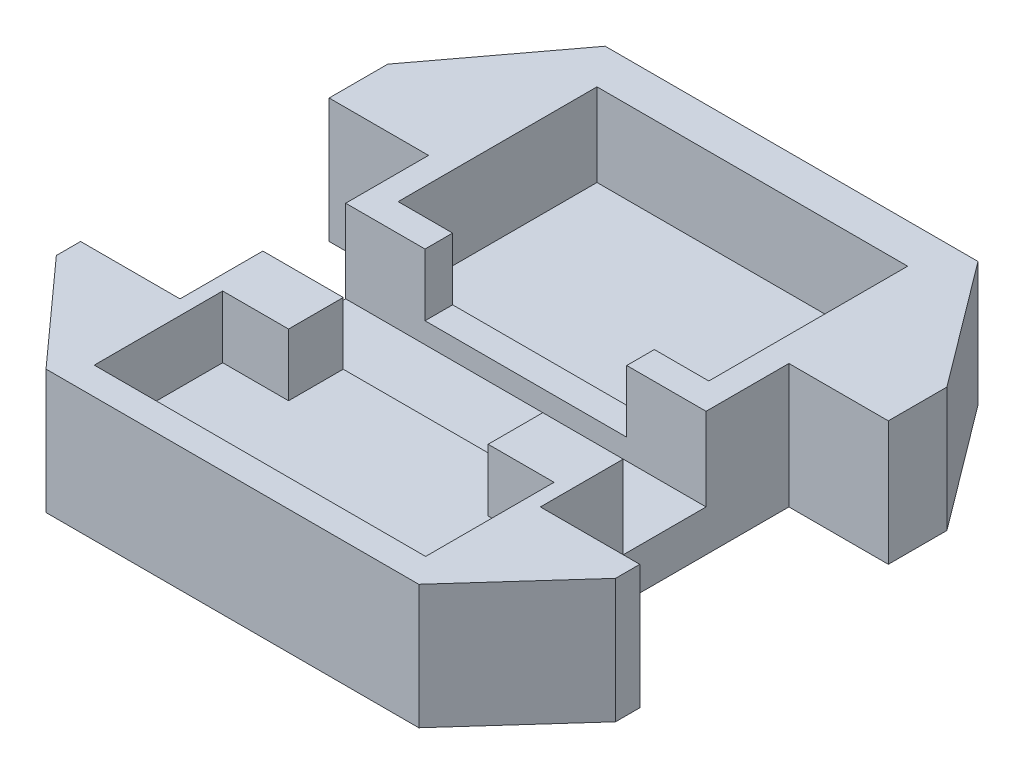
ISO-10303-21;
HEADER;
FILE_DESCRIPTION(('STEP AP214'),'2;1');
FILE_NAME('part.step','',(''),(''),'','','');
FILE_SCHEMA(('AUTOMOTIVE_DESIGN { 1 0 10303 214 1 1 1 1 }'));
ENDSEC;
DATA;
#1=APPLICATION_CONTEXT('core data for automotive mechanical design processes');
#2=APPLICATION_PROTOCOL_DEFINITION('international standard','automotive_design',2000,#1);
#3=PRODUCT_CONTEXT('',#1,'mechanical');
#4=PRODUCT('Part','Part','',(#3));
#5=PRODUCT_RELATED_PRODUCT_CATEGORY('part','',(#4));
#6=PRODUCT_DEFINITION_FORMATION('','',#4);
#7=PRODUCT_DEFINITION_CONTEXT('part definition',#1,'design');
#8=PRODUCT_DEFINITION('design','',#6,#7);
#9=PRODUCT_DEFINITION_SHAPE('','',#8);
#10=(LENGTH_UNIT() NAMED_UNIT(*) SI_UNIT(.MILLI.,.METRE.));
#11=(NAMED_UNIT(*) PLANE_ANGLE_UNIT() SI_UNIT($,.RADIAN.));
#12=(NAMED_UNIT(*) SI_UNIT($,.STERADIAN.) SOLID_ANGLE_UNIT());
#13=UNCERTAINTY_MEASURE_WITH_UNIT(LENGTH_MEASURE(1.E-05),#10,'distance_accuracy_value','');
#14=(GEOMETRIC_REPRESENTATION_CONTEXT(3) GLOBAL_UNCERTAINTY_ASSIGNED_CONTEXT((#13)) GLOBAL_UNIT_ASSIGNED_CONTEXT((#10,
#11,#12)) REPRESENTATION_CONTEXT('',''));
#15=CARTESIAN_POINT('',(0.,0.,0.));
#16=DIRECTION('',(0.,0.,1.));
#17=DIRECTION('',(1.,0.,0.));
#18=AXIS2_PLACEMENT_3D('',#15,#16,#17);
#19=CARTESIAN_POINT('',(-40.,15.,7.35083220721537));
#20=DIRECTION('',(0.,0.,-1.));
#21=DIRECTION('',(-1.,0.,0.));
#22=AXIS2_PLACEMENT_3D('',#19,#20,#21);
#23=PLANE('',#22);
#24=DIRECTION('',(-1.,0.,0.));
#25=VECTOR('',#24,1.);
#26=CARTESIAN_POINT('',(-40.,15.,7.35083220721537));
#27=LINE('',#26,#25);
#28=CARTESIAN_POINT('',(-24.09,15.,7.35083220721537));
#29=VERTEX_POINT('',#28);
#30=CARTESIAN_POINT('',(-40.,15.,7.35083220721537));
#31=VERTEX_POINT('',#30);
#32=EDGE_CURVE('E368',#29,#31,#27,.T.);
#33=ORIENTED_EDGE('',*,*,#32,.F.);
#34=DIRECTION('',(0.,1.,0.));
#35=VECTOR('',#34,1.);
#36=CARTESIAN_POINT('',(-24.09,15.,7.35083220721536));
#37=LINE('',#36,#35);
#38=CARTESIAN_POINT('',(-24.09,30.,7.35083220721536));
#39=VERTEX_POINT('',#38);
#40=EDGE_CURVE('E345',#29,#39,#37,.T.);
#41=ORIENTED_EDGE('',*,*,#40,.T.);
#42=DIRECTION('',(-1.,0.,0.));
#43=VECTOR('',#42,1.);
#44=CARTESIAN_POINT('',(-40.,30.,7.35083220721537));
#45=LINE('',#44,#43);
#46=CARTESIAN_POINT('',(-40.,30.,7.35083220721537));
#47=VERTEX_POINT('',#46);
#48=EDGE_CURVE('E380',#39,#47,#45,.T.);
#49=ORIENTED_EDGE('',*,*,#48,.T.);
#50=DIRECTION('',(0.,1.,0.));
#51=VECTOR('',#50,1.);
#52=CARTESIAN_POINT('',(-40.,15.,7.35083220721537));
#53=LINE('',#52,#51);
#54=EDGE_CURVE('E383',#31,#47,#53,.T.);
#55=ORIENTED_EDGE('',*,*,#54,.F.);
#56=EDGE_LOOP('',(#33,#41,#49,#55));
#57=FACE_BOUND('',#56,.T.);
#58=ADVANCED_FACE('F37',(#57),#23,.F.);
#59=CARTESIAN_POINT('',(0.,30.,0.));
#60=DIRECTION('',(0.,1.,0.));
#61=DIRECTION('',(0.,0.,1.));
#62=AXIS2_PLACEMENT_3D('',#59,#60,#61);
#63=PLANE('',#62);
#64=DIRECTION('',(0.,0.,1.));
#65=VECTOR('',#64,1.);
#66=CARTESIAN_POINT('',(-24.09,30.,-5.8496519620122));
#67=LINE('',#66,#65);
#68=CARTESIAN_POINT('',(-24.09,30.,-5.8496519620122));
#69=VERTEX_POINT('',#68);
#70=EDGE_CURVE('E329',#69,#39,#67,.T.);
#71=ORIENTED_EDGE('',*,*,#70,.F.);
#72=DIRECTION('',(1.,0.,0.));
#73=VECTOR('',#72,1.);
#74=CARTESIAN_POINT('',(-64.0732015980916,30.,-5.8496519620122));
#75=LINE('',#74,#73);
#76=CARTESIAN_POINT('',(-43.5,30.,-5.8496519620122));
#77=VERTEX_POINT('',#76);
#78=EDGE_CURVE('E397',#77,#69,#75,.T.);
#79=ORIENTED_EDGE('',*,*,#78,.F.);
#80=DIRECTION('',(0.,0.,-1.));
#81=VECTOR('',#80,1.);
#82=CARTESIAN_POINT('',(-43.5,30.,0.));
#83=LINE('',#82,#81);
#84=CARTESIAN_POINT('',(-43.5,30.,14.1503480379878));
#85=VERTEX_POINT('',#84);
#86=EDGE_CURVE('E463',#85,#77,#83,.T.);
#87=ORIENTED_EDGE('',*,*,#86,.F.);
#88=DIRECTION('',(1.,0.,0.));
#89=VECTOR('',#88,1.);
#90=CARTESIAN_POINT('',(0.,30.,14.1503480379878));
#91=LINE('',#90,#89);
#92=CARTESIAN_POINT('',(-67.5,30.,14.1503480379878));
#93=VERTEX_POINT('',#92);
#94=EDGE_CURVE('E453',#93,#85,#91,.T.);
#95=ORIENTED_EDGE('',*,*,#94,.F.);
#96=DIRECTION('',(0.,0.,1.));
#97=VECTOR('',#96,1.);
#98=CARTESIAN_POINT('',(-67.5,30.,20.0000000000001));
#99=LINE('',#98,#97);
#100=CARTESIAN_POINT('',(-67.5,30.,20.0000000000001));
#101=VERTEX_POINT('',#100);
#102=EDGE_CURVE('E483',#93,#101,#99,.T.);
#103=ORIENTED_EDGE('',*,*,#102,.T.);
#104=DIRECTION('',(0.66896473162245,0.,0.743294146247166));
#105=VECTOR('',#104,1.);
#106=CARTESIAN_POINT('',(-45.,30.,45.0000000000001));
#107=LINE('',#106,#105);
#108=CARTESIAN_POINT('',(-45.,30.,45.0000000000001));
#109=VERTEX_POINT('',#108);
#110=EDGE_CURVE('E487',#101,#109,#107,.T.);
#111=ORIENTED_EDGE('',*,*,#110,.T.);
#112=DIRECTION('',(1.,0.,0.));
#113=VECTOR('',#112,1.);
#114=CARTESIAN_POINT('',(-45.,30.,45.0000000000001));
#115=LINE('',#114,#113);
#116=CARTESIAN_POINT('',(45.,30.,45.0000000000001));
#117=VERTEX_POINT('',#116);
#118=EDGE_CURVE('E489',#109,#117,#115,.T.);
#119=ORIENTED_EDGE('',*,*,#118,.T.);
#120=DIRECTION('',(0.66896473162245,0.,-0.743294146247166));
#121=VECTOR('',#120,1.);
#122=CARTESIAN_POINT('',(45.,30.,45.0000000000001));
#123=LINE('',#122,#121);
#124=CARTESIAN_POINT('',(67.5,30.,20.0000000000001));
#125=VERTEX_POINT('',#124);
#126=EDGE_CURVE('E469',#117,#125,#123,.T.);
#127=ORIENTED_EDGE('',*,*,#126,.T.);
#128=DIRECTION('',(0.,0.,-1.));
#129=VECTOR('',#128,1.);
#130=CARTESIAN_POINT('',(67.5,30.,20.0000000000001));
#131=LINE('',#130,#129);
#132=CARTESIAN_POINT('',(67.5,30.,14.1503480379878));
#133=VERTEX_POINT('',#132);
#134=EDGE_CURVE('E474',#125,#133,#131,.T.);
#135=ORIENTED_EDGE('',*,*,#134,.T.);
#136=DIRECTION('',(1.,0.,0.));
#137=VECTOR('',#136,1.);
#138=CARTESIAN_POINT('',(0.,30.,14.1503480379878));
#139=LINE('',#138,#137);
#140=CARTESIAN_POINT('',(43.5,30.,14.1503480379878));
#141=VERTEX_POINT('',#140);
#142=EDGE_CURVE('E425',#141,#133,#139,.T.);
#143=ORIENTED_EDGE('',*,*,#142,.F.);
#144=DIRECTION('',(0.,0.,1.));
#145=VECTOR('',#144,1.);
#146=CARTESIAN_POINT('',(43.5,30.,0.));
#147=LINE('',#146,#145);
#148=CARTESIAN_POINT('',(43.5,30.,-5.8496519620122));
#149=VERTEX_POINT('',#148);
#150=EDGE_CURVE('E436',#149,#141,#147,.T.);
#151=ORIENTED_EDGE('',*,*,#150,.F.);
#152=CARTESIAN_POINT('',(24.09,30.,-5.8496519620122));
#153=VERTEX_POINT('',#152);
#154=EDGE_CURVE('E402',#153,#149,#75,.T.);
#155=ORIENTED_EDGE('',*,*,#154,.F.);
#156=DIRECTION('',(0.,0.,-1.));
#157=VECTOR('',#156,1.);
#158=CARTESIAN_POINT('',(24.09,30.,-5.8496519620122));
#159=LINE('',#158,#157);
#160=CARTESIAN_POINT('',(24.09,30.,7.35083220721536));
#161=VERTEX_POINT('',#160);
#162=EDGE_CURVE('E339',#161,#153,#159,.T.);
#163=ORIENTED_EDGE('',*,*,#162,.F.);
#164=CARTESIAN_POINT('',(40.,30.,7.35083220721536));
#165=VERTEX_POINT('',#164);
#166=EDGE_CURVE('E362',#165,#161,#45,.T.);
#167=ORIENTED_EDGE('',*,*,#166,.F.);
#168=DIRECTION('',(0.,0.,-1.));
#169=VECTOR('',#168,1.);
#170=CARTESIAN_POINT('',(40.,30.,7.35083220721536));
#171=LINE('',#170,#169);
#172=CARTESIAN_POINT('',(40.,30.,38.3508322072154));
#173=VERTEX_POINT('',#172);
#174=EDGE_CURVE('E377',#173,#165,#171,.T.);
#175=ORIENTED_EDGE('',*,*,#174,.F.);
#176=DIRECTION('',(1.,0.,0.));
#177=VECTOR('',#176,1.);
#178=CARTESIAN_POINT('',(-40.,30.,38.3508322072154));
#179=LINE('',#178,#177);
#180=CARTESIAN_POINT('',(-40.,30.,38.3508322072154));
#181=VERTEX_POINT('',#180);
#182=EDGE_CURVE('E374',#181,#173,#179,.T.);
#183=ORIENTED_EDGE('',*,*,#182,.F.);
#184=DIRECTION('',(0.,0.,1.));
#185=VECTOR('',#184,1.);
#186=CARTESIAN_POINT('',(-40.,30.,7.35083220721537));
#187=LINE('',#186,#185);
#188=EDGE_CURVE('E350',#47,#181,#187,.T.);
#189=ORIENTED_EDGE('',*,*,#188,.F.);
#190=ORIENTED_EDGE('',*,*,#48,.F.);
#191=EDGE_LOOP('',(#71,#79,#87,#95,#103,#111,#119,#127,#135,#143,#151,#155,#163,#167,#175,#183,
#189,#190));
#192=FACE_BOUND('',#191,.T.);
#193=ADVANCED_FACE('F570',(#192),#63,.T.);
#194=CARTESIAN_POINT('',(67.5,30.,20.0000000000001));
#195=DIRECTION('',(-1.,0.,0.));
#196=DIRECTION('',(0.,0.,1.));
#197=AXIS2_PLACEMENT_3D('',#194,#195,#196);
#198=PLANE('',#197);
#199=CARTESIAN_POINT('',(67.5,30.,-45.8496519620122));
#200=VERTEX_POINT('',#199);
#201=CARTESIAN_POINT('',(67.5,30.,-59.9999999999999));
#202=VERTEX_POINT('',#201);
#203=EDGE_CURVE('E472',#200,#202,#131,.T.);
#204=ORIENTED_EDGE('',*,*,#203,.F.);
#205=DIRECTION('',(0.,1.,0.));
#206=VECTOR('',#205,1.);
#207=CARTESIAN_POINT('',(67.5,0.,-45.8496519620122));
#208=LINE('',#207,#206);
#209=CARTESIAN_POINT('',(67.5,0.,-45.8496519620122));
#210=VERTEX_POINT('',#209);
#211=EDGE_CURVE('E426',#210,#200,#208,.T.);
#212=ORIENTED_EDGE('',*,*,#211,.F.);
#213=DIRECTION('',(0.,0.,-1.));
#214=VECTOR('',#213,1.);
#215=CARTESIAN_POINT('',(67.5,0.,20.0000000000001));
#216=LINE('',#215,#214);
#217=CARTESIAN_POINT('',(67.5,0.,-59.9999999999999));
#218=VERTEX_POINT('',#217);
#219=EDGE_CURVE('E494',#210,#218,#216,.T.);
#220=ORIENTED_EDGE('',*,*,#219,.T.);
#221=DIRECTION('',(0.,-1.,0.));
#222=VECTOR('',#221,1.);
#223=CARTESIAN_POINT('',(67.5,30.,-59.9999999999999));
#224=LINE('',#223,#222);
#225=EDGE_CURVE('E528',#202,#218,#224,.T.);
#226=ORIENTED_EDGE('',*,*,#225,.F.);
#227=EDGE_LOOP('',(#204,#212,#220,#226));
#228=FACE_BOUND('',#227,.T.);
#229=ADVANCED_FACE('F590',(#228),#198,.F.);
#230=CARTESIAN_POINT('',(-67.5,30.,20.0000000000001));
#231=DIRECTION('',(1.,0.,0.));
#232=DIRECTION('',(0.,0.,-1.));
#233=AXIS2_PLACEMENT_3D('',#230,#231,#232);
#234=PLANE('',#233);
#235=DIRECTION('',(0.,0.,1.));
#236=VECTOR('',#235,1.);
#237=CARTESIAN_POINT('',(-67.5,0.,20.0000000000001));
#238=LINE('',#237,#236);
#239=CARTESIAN_POINT('',(-67.5,0.,-59.9999999999999));
#240=VERTEX_POINT('',#239);
#241=CARTESIAN_POINT('',(-67.5,0.,-45.8496519620122));
#242=VERTEX_POINT('',#241);
#243=EDGE_CURVE('E505',#240,#242,#238,.T.);
#244=ORIENTED_EDGE('',*,*,#243,.T.);
#245=DIRECTION('',(0.,1.,0.));
#246=VECTOR('',#245,1.);
#247=CARTESIAN_POINT('',(-67.5,0.,-45.8496519620122));
#248=LINE('',#247,#246);
#249=CARTESIAN_POINT('',(-67.5,30.,-45.8496519620122));
#250=VERTEX_POINT('',#249);
#251=EDGE_CURVE('E450',#242,#250,#248,.T.);
#252=ORIENTED_EDGE('',*,*,#251,.T.);
#253=CARTESIAN_POINT('',(-67.5,30.,-59.9999999999999));
#254=VERTEX_POINT('',#253);
#255=EDGE_CURVE('E484',#254,#250,#99,.T.);
#256=ORIENTED_EDGE('',*,*,#255,.F.);
#257=DIRECTION('',(0.,-1.,0.));
#258=VECTOR('',#257,1.);
#259=CARTESIAN_POINT('',(-67.5,30.,-59.9999999999999));
#260=LINE('',#259,#258);
#261=EDGE_CURVE('E519',#254,#240,#260,.T.);
#262=ORIENTED_EDGE('',*,*,#261,.T.);
#263=EDGE_LOOP('',(#244,#252,#256,#262));
#264=FACE_BOUND('',#263,.T.);
#265=ADVANCED_FACE('F609',(#264),#234,.F.);
#266=CARTESIAN_POINT('',(45.,30.,45.0000000000001));
#267=DIRECTION('',(-0.743294146247166,0.,-0.66896473162245));
#268=DIRECTION('',(-0.66896473162245,0.,0.743294146247166));
#269=AXIS2_PLACEMENT_3D('',#266,#267,#268);
#270=PLANE('',#269);
#271=DIRECTION('',(0.66896473162245,0.,-0.743294146247166));
#272=VECTOR('',#271,1.);
#273=CARTESIAN_POINT('',(45.,0.,45.0000000000001));
#274=LINE('',#273,#272);
#275=CARTESIAN_POINT('',(45.,0.,45.0000000000001));
#276=VERTEX_POINT('',#275);
#277=CARTESIAN_POINT('',(67.5,0.,20.0000000000001));
#278=VERTEX_POINT('',#277);
#279=EDGE_CURVE('E468',#276,#278,#274,.T.);
#280=ORIENTED_EDGE('',*,*,#279,.T.);
#281=DIRECTION('',(0.,-1.,0.));
#282=VECTOR('',#281,1.);
#283=CARTESIAN_POINT('',(67.5,30.,20.0000000000001));
#284=LINE('',#283,#282);
#285=EDGE_CURVE('E531',#125,#278,#284,.T.);
#286=ORIENTED_EDGE('',*,*,#285,.F.);
#287=ORIENTED_EDGE('',*,*,#126,.F.);
#288=DIRECTION('',(0.,-1.,0.));
#289=VECTOR('',#288,1.);
#290=CARTESIAN_POINT('',(45.,30.,45.0000000000001));
#291=LINE('',#290,#289);
#292=EDGE_CURVE('E491',#117,#276,#291,.T.);
#293=ORIENTED_EDGE('',*,*,#292,.T.);
#294=EDGE_LOOP('',(#280,#286,#287,#293));
#295=FACE_BOUND('',#294,.T.);
#296=ADVANCED_FACE('F39',(#295),#270,.F.);
#297=CARTESIAN_POINT('',(67.5,0.,14.1503480379878));
#298=VERTEX_POINT('',#297);
#299=EDGE_CURVE('E495',#278,#298,#216,.T.);
#300=ORIENTED_EDGE('',*,*,#299,.T.);
#301=DIRECTION('',(0.,1.,0.));
#302=VECTOR('',#301,1.);
#303=CARTESIAN_POINT('',(67.5,0.,14.1503480379878));
#304=LINE('',#303,#302);
#305=EDGE_CURVE('E428',#298,#133,#304,.T.);
#306=ORIENTED_EDGE('',*,*,#305,.T.);
#307=ORIENTED_EDGE('',*,*,#134,.F.);
#308=ORIENTED_EDGE('',*,*,#285,.T.);
#309=EDGE_LOOP('',(#300,#306,#307,#308));
#310=FACE_BOUND('',#309,.T.);
#311=ADVANCED_FACE('F576',(#310),#198,.F.);
#312=CARTESIAN_POINT('',(67.5,30.,-59.9999999999999));
#313=DIRECTION('',(-0.800000000000001,0.,0.599999999999999));
#314=DIRECTION('',(0.599999999999999,0.,0.800000000000001));
#315=AXIS2_PLACEMENT_3D('',#312,#313,#314);
#316=PLANE('',#315);
#317=DIRECTION('',(-0.599999999999999,0.,-0.800000000000001));
#318=VECTOR('',#317,1.);
#319=CARTESIAN_POINT('',(67.5,0.,-59.9999999999999));
#320=LINE('',#319,#318);
#321=CARTESIAN_POINT('',(45.,0.,-90.));
#322=VERTEX_POINT('',#321);
#323=EDGE_CURVE('E498',#218,#322,#320,.T.);
#324=ORIENTED_EDGE('',*,*,#323,.T.);
#325=DIRECTION('',(0.,-1.,0.));
#326=VECTOR('',#325,1.);
#327=CARTESIAN_POINT('',(45.,30.,-90.));
#328=LINE('',#327,#326);
#329=CARTESIAN_POINT('',(45.,30.,-90.));
#330=VERTEX_POINT('',#329);
#331=EDGE_CURVE('E525',#330,#322,#328,.T.);
#332=ORIENTED_EDGE('',*,*,#331,.F.);
#333=DIRECTION('',(-0.599999999999999,0.,-0.800000000000001));
#334=VECTOR('',#333,1.);
#335=CARTESIAN_POINT('',(67.5,30.,-59.9999999999999));
#336=LINE('',#335,#334);
#337=EDGE_CURVE('E477',#202,#330,#336,.T.);
#338=ORIENTED_EDGE('',*,*,#337,.F.);
#339=ORIENTED_EDGE('',*,*,#225,.T.);
#340=EDGE_LOOP('',(#324,#332,#338,#339));
#341=FACE_BOUND('',#340,.T.);
#342=ADVANCED_FACE('F595',(#341),#316,.F.);
#343=CARTESIAN_POINT('',(45.,30.,-90.));
#344=DIRECTION('',(0.,0.,1.));
#345=DIRECTION('',(1.,0.,0.));
#346=AXIS2_PLACEMENT_3D('',#343,#344,#345);
#347=PLANE('',#346);
#348=DIRECTION('',(-1.,0.,0.));
#349=VECTOR('',#348,1.);
#350=CARTESIAN_POINT('',(45.,0.,-90.));
#351=LINE('',#350,#349);
#352=CARTESIAN_POINT('',(-45.,0.,-90.));
#353=VERTEX_POINT('',#352);
#354=EDGE_CURVE('E500',#322,#353,#351,.T.);
#355=ORIENTED_EDGE('',*,*,#354,.T.);
#356=DIRECTION('',(0.,-1.,0.));
#357=VECTOR('',#356,1.);
#358=CARTESIAN_POINT('',(-45.,30.,-90.));
#359=LINE('',#358,#357);
#360=CARTESIAN_POINT('',(-45.,30.,-90.));
#361=VERTEX_POINT('',#360);
#362=EDGE_CURVE('E522',#361,#353,#359,.T.);
#363=ORIENTED_EDGE('',*,*,#362,.F.);
#364=DIRECTION('',(-1.,0.,0.));
#365=VECTOR('',#364,1.);
#366=CARTESIAN_POINT('',(45.,30.,-90.));
#367=LINE('',#366,#365);
#368=EDGE_CURVE('E479',#330,#361,#367,.T.);
#369=ORIENTED_EDGE('',*,*,#368,.F.);
#370=ORIENTED_EDGE('',*,*,#331,.T.);
#371=EDGE_LOOP('',(#355,#363,#369,#370));
#372=FACE_BOUND('',#371,.T.);
#373=ADVANCED_FACE('F601',(#372),#347,.F.);
#374=CARTESIAN_POINT('',(-67.5,30.,-59.9999999999999));
#375=DIRECTION('',(0.800000000000001,0.,0.599999999999999));
#376=DIRECTION('',(0.599999999999999,0.,-0.800000000000001));
#377=AXIS2_PLACEMENT_3D('',#374,#375,#376);
#378=PLANE('',#377);
#379=DIRECTION('',(-0.599999999999999,0.,0.800000000000001));
#380=VECTOR('',#379,1.);
#381=CARTESIAN_POINT('',(-67.5,0.,-59.9999999999999));
#382=LINE('',#381,#380);
#383=EDGE_CURVE('E502',#353,#240,#382,.T.);
#384=ORIENTED_EDGE('',*,*,#383,.T.);
#385=ORIENTED_EDGE('',*,*,#261,.F.);
#386=DIRECTION('',(-0.599999999999999,0.,0.800000000000001));
#387=VECTOR('',#386,1.);
#388=CARTESIAN_POINT('',(-67.5,30.,-59.9999999999999));
#389=LINE('',#388,#387);
#390=EDGE_CURVE('E481',#361,#254,#389,.T.);
#391=ORIENTED_EDGE('',*,*,#390,.F.);
#392=ORIENTED_EDGE('',*,*,#362,.T.);
#393=EDGE_LOOP('',(#384,#385,#391,#392));
#394=FACE_BOUND('',#393,.T.);
#395=ADVANCED_FACE('F605',(#394),#378,.F.);
#396=ORIENTED_EDGE('',*,*,#102,.F.);
#397=DIRECTION('',(0.,1.,0.));
#398=VECTOR('',#397,1.);
#399=CARTESIAN_POINT('',(-67.5,0.,14.1503480379878));
#400=LINE('',#399,#398);
#401=CARTESIAN_POINT('',(-67.5,0.,14.1503480379878));
#402=VERTEX_POINT('',#401);
#403=EDGE_CURVE('E449',#402,#93,#400,.T.);
#404=ORIENTED_EDGE('',*,*,#403,.F.);
#405=CARTESIAN_POINT('',(-67.5,0.,20.0000000000001));
#406=VERTEX_POINT('',#405);
#407=EDGE_CURVE('E504',#402,#406,#238,.T.);
#408=ORIENTED_EDGE('',*,*,#407,.T.);
#409=DIRECTION('',(0.,-1.,0.));
#410=VECTOR('',#409,1.);
#411=CARTESIAN_POINT('',(-67.5,30.,20.0000000000001));
#412=LINE('',#411,#410);
#413=EDGE_CURVE('E516',#101,#406,#412,.T.);
#414=ORIENTED_EDGE('',*,*,#413,.F.);
#415=EDGE_LOOP('',(#396,#404,#408,#414));
#416=FACE_BOUND('',#415,.T.);
#417=ADVANCED_FACE('F624',(#416),#234,.F.);
#418=CARTESIAN_POINT('',(-45.,30.,45.0000000000001));
#419=DIRECTION('',(0.743294146247166,0.,-0.66896473162245));
#420=DIRECTION('',(-0.66896473162245,0.,-0.743294146247166));
#421=AXIS2_PLACEMENT_3D('',#418,#419,#420);
#422=PLANE('',#421);
#423=DIRECTION('',(0.66896473162245,0.,0.743294146247166));
#424=VECTOR('',#423,1.);
#425=CARTESIAN_POINT('',(-45.,0.,45.0000000000001));
#426=LINE('',#425,#424);
#427=CARTESIAN_POINT('',(-45.,0.,45.0000000000001));
#428=VERTEX_POINT('',#427);
#429=EDGE_CURVE('E508',#406,#428,#426,.T.);
#430=ORIENTED_EDGE('',*,*,#429,.T.);
#431=DIRECTION('',(0.,-1.,0.));
#432=VECTOR('',#431,1.);
#433=CARTESIAN_POINT('',(-45.,30.,45.0000000000001));
#434=LINE('',#433,#432);
#435=EDGE_CURVE('E513',#109,#428,#434,.T.);
#436=ORIENTED_EDGE('',*,*,#435,.F.);
#437=ORIENTED_EDGE('',*,*,#110,.F.);
#438=ORIENTED_EDGE('',*,*,#413,.T.);
#439=EDGE_LOOP('',(#430,#436,#437,#438));
#440=FACE_BOUND('',#439,.T.);
#441=ADVANCED_FACE('F627',(#440),#422,.F.);
#442=CARTESIAN_POINT('',(-45.,30.,45.0000000000001));
#443=DIRECTION('',(0.,0.,-1.));
#444=DIRECTION('',(-1.,0.,0.));
#445=AXIS2_PLACEMENT_3D('',#442,#443,#444);
#446=PLANE('',#445);
#447=DIRECTION('',(1.,0.,0.));
#448=VECTOR('',#447,1.);
#449=CARTESIAN_POINT('',(-45.,0.,45.0000000000001));
#450=LINE('',#449,#448);
#451=EDGE_CURVE('E473',#428,#276,#450,.T.);
#452=ORIENTED_EDGE('',*,*,#451,.T.);
#453=ORIENTED_EDGE('',*,*,#292,.F.);
#454=ORIENTED_EDGE('',*,*,#118,.F.);
#455=ORIENTED_EDGE('',*,*,#435,.T.);
#456=EDGE_LOOP('',(#452,#453,#454,#455));
#457=FACE_BOUND('',#456,.T.);
#458=ADVANCED_FACE('F698',(#457),#446,.F.);
#459=DIRECTION('',(0.,0.,1.));
#460=VECTOR('',#459,1.);
#461=CARTESIAN_POINT('',(-24.35,30.,-32.5158890877823));
#462=LINE('',#461,#460);
#463=CARTESIAN_POINT('',(-24.35,30.,-32.5158890877823));
#464=VERTEX_POINT('',#463);
#465=CARTESIAN_POINT('',(-24.35,30.,-25.8496519620122));
#466=VERTEX_POINT('',#465);
#467=EDGE_CURVE('E275',#464,#466,#462,.T.);
#468=ORIENTED_EDGE('',*,*,#467,.F.);
#469=DIRECTION('',(1.,0.,0.));
#470=VECTOR('',#469,1.);
#471=CARTESIAN_POINT('',(-37.5,30.,-32.5158890877823));
#472=LINE('',#471,#470);
#473=CARTESIAN_POINT('',(-37.5,30.,-32.5158890877823));
#474=VERTEX_POINT('',#473);
#475=EDGE_CURVE('E319',#474,#464,#472,.T.);
#476=ORIENTED_EDGE('',*,*,#475,.F.);
#477=DIRECTION('',(0.,0.,1.));
#478=VECTOR('',#477,1.);
#479=CARTESIAN_POINT('',(-37.5,30.,-80.5158890877823));
#480=LINE('',#479,#478);
#481=CARTESIAN_POINT('',(-37.5,30.,-80.5158890877823));
#482=VERTEX_POINT('',#481);
#483=EDGE_CURVE('E60',#482,#474,#480,.T.);
#484=ORIENTED_EDGE('',*,*,#483,.F.);
#485=DIRECTION('',(-1.,0.,0.));
#486=VECTOR('',#485,1.);
#487=CARTESIAN_POINT('',(-37.5,30.,-80.5158890877823));
#488=LINE('',#487,#486);
#489=CARTESIAN_POINT('',(37.5,30.,-80.5158890877823));
#490=VERTEX_POINT('',#489);
#491=EDGE_CURVE('E307',#490,#482,#488,.T.);
#492=ORIENTED_EDGE('',*,*,#491,.F.);
#493=DIRECTION('',(0.,0.,-1.));
#494=VECTOR('',#493,1.);
#495=CARTESIAN_POINT('',(37.5,30.,-80.5158890877823));
#496=LINE('',#495,#494);
#497=CARTESIAN_POINT('',(37.5,30.,-32.5158890877823));
#498=VERTEX_POINT('',#497);
#499=EDGE_CURVE('E322',#498,#490,#496,.T.);
#500=ORIENTED_EDGE('',*,*,#499,.F.);
#501=CARTESIAN_POINT('',(24.35,30.,-32.5158890877823));
#502=VERTEX_POINT('',#501);
#503=EDGE_CURVE('E318',#502,#498,#472,.T.);
#504=ORIENTED_EDGE('',*,*,#503,.F.);
#505=DIRECTION('',(0.,0.,-1.));
#506=VECTOR('',#505,1.);
#507=CARTESIAN_POINT('',(24.35,30.,-32.5158890877823));
#508=LINE('',#507,#506);
#509=CARTESIAN_POINT('',(24.35,30.,-25.8496519620122));
#510=VERTEX_POINT('',#509);
#511=EDGE_CURVE('E287',#510,#502,#508,.T.);
#512=ORIENTED_EDGE('',*,*,#511,.F.);
#513=DIRECTION('',(-1.,0.,0.));
#514=VECTOR('',#513,1.);
#515=CARTESIAN_POINT('',(-64.0732015980916,30.,-25.8496519620122));
#516=LINE('',#515,#514);
#517=CARTESIAN_POINT('',(43.5,30.,-25.8496519620122));
#518=VERTEX_POINT('',#517);
#519=EDGE_CURVE('E400',#518,#510,#516,.T.);
#520=ORIENTED_EDGE('',*,*,#519,.F.);
#521=CARTESIAN_POINT('',(43.5,30.,-45.8496519620122));
#522=VERTEX_POINT('',#521);
#523=EDGE_CURVE('E437',#522,#518,#147,.T.);
#524=ORIENTED_EDGE('',*,*,#523,.F.);
#525=DIRECTION('',(-1.,0.,0.));
#526=VECTOR('',#525,1.);
#527=CARTESIAN_POINT('',(0.,30.,-45.8496519620122));
#528=LINE('',#527,#526);
#529=EDGE_CURVE('E434',#200,#522,#528,.T.);
#530=ORIENTED_EDGE('',*,*,#529,.F.);
#531=ORIENTED_EDGE('',*,*,#203,.T.);
#532=ORIENTED_EDGE('',*,*,#337,.T.);
#533=ORIENTED_EDGE('',*,*,#368,.T.);
#534=ORIENTED_EDGE('',*,*,#390,.T.);
#535=ORIENTED_EDGE('',*,*,#255,.T.);
#536=DIRECTION('',(-1.,0.,0.));
#537=VECTOR('',#536,1.);
#538=CARTESIAN_POINT('',(0.,30.,-45.8496519620122));
#539=LINE('',#538,#537);
#540=CARTESIAN_POINT('',(-43.5,30.,-45.8496519620122));
#541=VERTEX_POINT('',#540);
#542=EDGE_CURVE('E466',#541,#250,#539,.T.);
#543=ORIENTED_EDGE('',*,*,#542,.F.);
#544=CARTESIAN_POINT('',(-43.5,30.,-25.8496519620122));
#545=VERTEX_POINT('',#544);
#546=EDGE_CURVE('E462',#545,#541,#83,.T.);
#547=ORIENTED_EDGE('',*,*,#546,.F.);
#548=EDGE_CURVE('E386',#466,#545,#516,.T.);
#549=ORIENTED_EDGE('',*,*,#548,.F.);
#550=EDGE_LOOP('',(#468,#476,#484,#492,#500,#504,#512,#520,#524,#530,#531,#532,#533,#534,#535,
#543,#547,#549));
#551=FACE_BOUND('',#550,.T.);
#552=ADVANCED_FACE('F544',(#551),#63,.T.);
#553=CARTESIAN_POINT('',(0.,0.,0.));
#554=DIRECTION('',(0.,1.,0.));
#555=DIRECTION('',(0.,0.,1.));
#556=AXIS2_PLACEMENT_3D('',#553,#554,#555);
#557=PLANE('',#556);
#558=ORIENTED_EDGE('',*,*,#219,.F.);
#559=DIRECTION('',(-1.,0.,0.));
#560=VECTOR('',#559,1.);
#561=CARTESIAN_POINT('',(43.5,0.,-45.8496519620122));
#562=LINE('',#561,#560);
#563=CARTESIAN_POINT('',(43.5,0.,-45.8496519620122));
#564=VERTEX_POINT('',#563);
#565=EDGE_CURVE('E418',#210,#564,#562,.T.);
#566=ORIENTED_EDGE('',*,*,#565,.T.);
#567=DIRECTION('',(0.,0.,1.));
#568=VECTOR('',#567,1.);
#569=CARTESIAN_POINT('',(43.5,0.,-45.8496519620122));
#570=LINE('',#569,#568);
#571=CARTESIAN_POINT('',(43.5,0.,14.1503480379878));
#572=VERTEX_POINT('',#571);
#573=EDGE_CURVE('E412',#564,#572,#570,.T.);
#574=ORIENTED_EDGE('',*,*,#573,.T.);
#575=DIRECTION('',(1.,0.,0.));
#576=VECTOR('',#575,1.);
#577=CARTESIAN_POINT('',(43.5,0.,14.1503480379878));
#578=LINE('',#577,#576);
#579=EDGE_CURVE('E415',#572,#298,#578,.T.);
#580=ORIENTED_EDGE('',*,*,#579,.T.);
#581=ORIENTED_EDGE('',*,*,#299,.F.);
#582=ORIENTED_EDGE('',*,*,#279,.F.);
#583=ORIENTED_EDGE('',*,*,#451,.F.);
#584=ORIENTED_EDGE('',*,*,#429,.F.);
#585=ORIENTED_EDGE('',*,*,#407,.F.);
#586=DIRECTION('',(1.,0.,0.));
#587=VECTOR('',#586,1.);
#588=CARTESIAN_POINT('',(-67.5,0.,14.1503480379878));
#589=LINE('',#588,#587);
#590=CARTESIAN_POINT('',(-43.5,0.,14.1503480379878));
#591=VERTEX_POINT('',#590);
#592=EDGE_CURVE('E440',#402,#591,#589,.T.);
#593=ORIENTED_EDGE('',*,*,#592,.T.);
#594=DIRECTION('',(0.,0.,-1.));
#595=VECTOR('',#594,1.);
#596=CARTESIAN_POINT('',(-43.5,0.,-45.8496519620122));
#597=LINE('',#596,#595);
#598=CARTESIAN_POINT('',(-43.5,0.,-45.8496519620122));
#599=VERTEX_POINT('',#598);
#600=EDGE_CURVE('E443',#591,#599,#597,.T.);
#601=ORIENTED_EDGE('',*,*,#600,.T.);
#602=DIRECTION('',(-1.,0.,0.));
#603=VECTOR('',#602,1.);
#604=CARTESIAN_POINT('',(-67.5,0.,-45.8496519620122));
#605=LINE('',#604,#603);
#606=EDGE_CURVE('E446',#599,#242,#605,.T.);
#607=ORIENTED_EDGE('',*,*,#606,.T.);
#608=ORIENTED_EDGE('',*,*,#243,.F.);
#609=ORIENTED_EDGE('',*,*,#383,.F.);
#610=ORIENTED_EDGE('',*,*,#354,.F.);
#611=ORIENTED_EDGE('',*,*,#323,.F.);
#612=EDGE_LOOP('',(#558,#566,#574,#580,#581,#582,#583,#584,#585,#593,#601,#607,#608,#609,#610,#611));
#613=FACE_BOUND('',#612,.T.);
#614=ADVANCED_FACE('F581',(#613),#557,.F.);
#615=CARTESIAN_POINT('',(-67.5,0.,-45.8496519620122));
#616=DIRECTION('',(0.,0.,-1.));
#617=DIRECTION('',(-1.,0.,0.));
#618=AXIS2_PLACEMENT_3D('',#615,#616,#617);
#619=PLANE('',#618);
#620=ORIENTED_EDGE('',*,*,#542,.T.);
#621=ORIENTED_EDGE('',*,*,#251,.F.);
#622=ORIENTED_EDGE('',*,*,#606,.F.);
#623=DIRECTION('',(0.,1.,0.));
#624=VECTOR('',#623,1.);
#625=CARTESIAN_POINT('',(-43.5,0.,-45.8496519620122));
#626=LINE('',#625,#624);
#627=EDGE_CURVE('E454',#599,#541,#626,.T.);
#628=ORIENTED_EDGE('',*,*,#627,.T.);
#629=EDGE_LOOP('',(#620,#621,#622,#628));
#630=FACE_BOUND('',#629,.T.);
#631=ADVANCED_FACE('F611',(#630),#619,.F.);
#632=CARTESIAN_POINT('',(-43.5,0.,-45.8496519620122));
#633=DIRECTION('',(1.,0.,0.));
#634=DIRECTION('',(0.,0.,-1.));
#635=AXIS2_PLACEMENT_3D('',#632,#633,#634);
#636=PLANE('',#635);
#637=ORIENTED_EDGE('',*,*,#86,.T.);
#638=DIRECTION('',(0.,-1.,0.));
#639=VECTOR('',#638,1.);
#640=CARTESIAN_POINT('',(-43.5,0.,-5.8496519620122));
#641=LINE('',#640,#639);
#642=CARTESIAN_POINT('',(-43.5,10.,-5.8496519620122));
#643=VERTEX_POINT('',#642);
#644=EDGE_CURVE('E409',#77,#643,#641,.T.);
#645=ORIENTED_EDGE('',*,*,#644,.T.);
#646=DIRECTION('',(0.,0.,1.));
#647=VECTOR('',#646,1.);
#648=CARTESIAN_POINT('',(-43.5,10.,-45.8496519620122));
#649=LINE('',#648,#647);
#650=CARTESIAN_POINT('',(-43.5,10.,-25.8496519620122));
#651=VERTEX_POINT('',#650);
#652=EDGE_CURVE('E399',#651,#643,#649,.T.);
#653=ORIENTED_EDGE('',*,*,#652,.F.);
#654=DIRECTION('',(0.,1.,0.));
#655=VECTOR('',#654,1.);
#656=CARTESIAN_POINT('',(-43.5,0.,-25.8496519620122));
#657=LINE('',#656,#655);
#658=EDGE_CURVE('E406',#651,#545,#657,.T.);
#659=ORIENTED_EDGE('',*,*,#658,.T.);
#660=ORIENTED_EDGE('',*,*,#546,.T.);
#661=ORIENTED_EDGE('',*,*,#627,.F.);
#662=ORIENTED_EDGE('',*,*,#600,.F.);
#663=DIRECTION('',(0.,1.,0.));
#664=VECTOR('',#663,1.);
#665=CARTESIAN_POINT('',(-43.5,0.,14.1503480379878));
#666=LINE('',#665,#664);
#667=EDGE_CURVE('E457',#591,#85,#666,.T.);
#668=ORIENTED_EDGE('',*,*,#667,.T.);
#669=EDGE_LOOP('',(#637,#645,#653,#659,#660,#661,#662,#668));
#670=FACE_BOUND('',#669,.T.);
#671=ADVANCED_FACE('F557',(#670),#636,.F.);
#672=CARTESIAN_POINT('',(-67.5,0.,14.1503480379878));
#673=DIRECTION('',(0.,0.,1.));
#674=DIRECTION('',(1.,0.,0.));
#675=AXIS2_PLACEMENT_3D('',#672,#673,#674);
#676=PLANE('',#675);
#677=ORIENTED_EDGE('',*,*,#94,.T.);
#678=ORIENTED_EDGE('',*,*,#667,.F.);
#679=ORIENTED_EDGE('',*,*,#592,.F.);
#680=ORIENTED_EDGE('',*,*,#403,.T.);
#681=EDGE_LOOP('',(#677,#678,#679,#680));
#682=FACE_BOUND('',#681,.T.);
#683=ADVANCED_FACE('F616',(#682),#676,.F.);
#684=CARTESIAN_POINT('',(43.5,0.,-45.8496519620122));
#685=DIRECTION('',(-1.,0.,0.));
#686=DIRECTION('',(0.,0.,1.));
#687=AXIS2_PLACEMENT_3D('',#684,#685,#686);
#688=PLANE('',#687);
#689=DIRECTION('',(0.,0.,-1.));
#690=VECTOR('',#689,1.);
#691=CARTESIAN_POINT('',(43.5,10.,-45.8496519620122));
#692=LINE('',#691,#690);
#693=CARTESIAN_POINT('',(43.5,10.,-5.84965196201221));
#694=VERTEX_POINT('',#693);
#695=CARTESIAN_POINT('',(43.5,10.,-25.8496519620122));
#696=VERTEX_POINT('',#695);
#697=EDGE_CURVE('E534',#694,#696,#692,.T.);
#698=ORIENTED_EDGE('',*,*,#697,.F.);
#699=DIRECTION('',(0.,1.,0.));
#700=VECTOR('',#699,1.);
#701=CARTESIAN_POINT('',(43.5,0.,-5.8496519620122));
#702=LINE('',#701,#700);
#703=EDGE_CURVE('E11',#694,#149,#702,.T.);
#704=ORIENTED_EDGE('',*,*,#703,.T.);
#705=ORIENTED_EDGE('',*,*,#150,.T.);
#706=DIRECTION('',(0.,1.,0.));
#707=VECTOR('',#706,1.);
#708=CARTESIAN_POINT('',(43.5,0.,14.1503480379878));
#709=LINE('',#708,#707);
#710=EDGE_CURVE('E421',#572,#141,#709,.T.);
#711=ORIENTED_EDGE('',*,*,#710,.F.);
#712=ORIENTED_EDGE('',*,*,#573,.F.);
#713=DIRECTION('',(0.,1.,0.));
#714=VECTOR('',#713,1.);
#715=CARTESIAN_POINT('',(43.5,0.,-45.8496519620122));
#716=LINE('',#715,#714);
#717=EDGE_CURVE('E422',#564,#522,#716,.T.);
#718=ORIENTED_EDGE('',*,*,#717,.T.);
#719=ORIENTED_EDGE('',*,*,#523,.T.);
#720=DIRECTION('',(0.,-1.,0.));
#721=VECTOR('',#720,1.);
#722=CARTESIAN_POINT('',(43.5,0.,-25.8496519620122));
#723=LINE('',#722,#721);
#724=EDGE_CURVE('E45',#518,#696,#723,.T.);
#725=ORIENTED_EDGE('',*,*,#724,.T.);
#726=EDGE_LOOP('',(#698,#704,#705,#711,#712,#718,#719,#725));
#727=FACE_BOUND('',#726,.T.);
#728=ADVANCED_FACE('F538',(#727),#688,.F.);
#729=CARTESIAN_POINT('',(43.5,0.,-45.8496519620122));
#730=DIRECTION('',(0.,0.,-1.));
#731=DIRECTION('',(-1.,0.,0.));
#732=AXIS2_PLACEMENT_3D('',#729,#730,#731);
#733=PLANE('',#732);
#734=ORIENTED_EDGE('',*,*,#529,.T.);
#735=ORIENTED_EDGE('',*,*,#717,.F.);
#736=ORIENTED_EDGE('',*,*,#565,.F.);
#737=ORIENTED_EDGE('',*,*,#211,.T.);
#738=EDGE_LOOP('',(#734,#735,#736,#737));
#739=FACE_BOUND('',#738,.T.);
#740=ADVANCED_FACE('F585',(#739),#733,.F.);
#741=CARTESIAN_POINT('',(43.5,0.,14.1503480379878));
#742=DIRECTION('',(0.,0.,1.));
#743=DIRECTION('',(1.,0.,0.));
#744=AXIS2_PLACEMENT_3D('',#741,#742,#743);
#745=PLANE('',#744);
#746=ORIENTED_EDGE('',*,*,#142,.T.);
#747=ORIENTED_EDGE('',*,*,#305,.F.);
#748=ORIENTED_EDGE('',*,*,#579,.F.);
#749=ORIENTED_EDGE('',*,*,#710,.T.);
#750=EDGE_LOOP('',(#746,#747,#748,#749));
#751=FACE_BOUND('',#750,.T.);
#752=ADVANCED_FACE('F573',(#751),#745,.F.);
#753=CARTESIAN_POINT('',(-64.0732015980916,10.,-5.8496519620122));
#754=DIRECTION('',(0.,0.,1.));
#755=DIRECTION('',(1.,0.,0.));
#756=AXIS2_PLACEMENT_3D('',#753,#754,#755);
#757=PLANE('',#756);
#758=ORIENTED_EDGE('',*,*,#78,.T.);
#759=DIRECTION('',(0.,1.,0.));
#760=VECTOR('',#759,1.);
#761=CARTESIAN_POINT('',(-24.09,15.,-5.8496519620122));
#762=LINE('',#761,#760);
#763=CARTESIAN_POINT('',(-24.09,15.,-5.8496519620122));
#764=VERTEX_POINT('',#763);
#765=EDGE_CURVE('E348',#764,#69,#762,.T.);
#766=ORIENTED_EDGE('',*,*,#765,.F.);
#767=DIRECTION('',(-1.,0.,0.));
#768=VECTOR('',#767,1.);
#769=CARTESIAN_POINT('',(-24.09,15.,-5.8496519620122));
#770=LINE('',#769,#768);
#771=CARTESIAN_POINT('',(24.09,15.,-5.8496519620122));
#772=VERTEX_POINT('',#771);
#773=EDGE_CURVE('E342',#772,#764,#770,.T.);
#774=ORIENTED_EDGE('',*,*,#773,.F.);
#775=DIRECTION('',(0.,1.,0.));
#776=VECTOR('',#775,1.);
#777=CARTESIAN_POINT('',(24.09,15.,-5.8496519620122));
#778=LINE('',#777,#776);
#779=EDGE_CURVE('E351',#772,#153,#778,.T.);
#780=ORIENTED_EDGE('',*,*,#779,.T.);
#781=ORIENTED_EDGE('',*,*,#154,.T.);
#782=ORIENTED_EDGE('',*,*,#703,.F.);
#783=DIRECTION('',(1.,0.,0.));
#784=VECTOR('',#783,1.);
#785=CARTESIAN_POINT('',(-64.0732015980916,10.,-5.8496519620122));
#786=LINE('',#785,#784);
#787=EDGE_CURVE('E396',#643,#694,#786,.T.);
#788=ORIENTED_EDGE('',*,*,#787,.F.);
#789=ORIENTED_EDGE('',*,*,#644,.F.);
#790=EDGE_LOOP('',(#758,#766,#774,#780,#781,#782,#788,#789));
#791=FACE_BOUND('',#790,.T.);
#792=ADVANCED_FACE('F563',(#791),#757,.F.);
#793=CARTESIAN_POINT('',(-64.0732015980916,10.,-25.8496519620122));
#794=DIRECTION('',(0.,0.,-1.));
#795=DIRECTION('',(-1.,0.,0.));
#796=AXIS2_PLACEMENT_3D('',#793,#794,#795);
#797=PLANE('',#796);
#798=DIRECTION('',(1.,0.,0.));
#799=VECTOR('',#798,1.);
#800=CARTESIAN_POINT('',(-24.35,15.,-25.8496519620122));
#801=LINE('',#800,#799);
#802=CARTESIAN_POINT('',(-24.35,15.,-25.8496519620122));
#803=VERTEX_POINT('',#802);
#804=CARTESIAN_POINT('',(24.35,15.,-25.8496519620122));
#805=VERTEX_POINT('',#804);
#806=EDGE_CURVE('E283',#803,#805,#801,.T.);
#807=ORIENTED_EDGE('',*,*,#806,.F.);
#808=DIRECTION('',(0.,1.,0.));
#809=VECTOR('',#808,1.);
#810=CARTESIAN_POINT('',(-24.35,15.,-25.8496519620122));
#811=LINE('',#810,#809);
#812=EDGE_CURVE('E270',#803,#466,#811,.T.);
#813=ORIENTED_EDGE('',*,*,#812,.T.);
#814=ORIENTED_EDGE('',*,*,#548,.T.);
#815=ORIENTED_EDGE('',*,*,#658,.F.);
#816=DIRECTION('',(-1.,0.,0.));
#817=VECTOR('',#816,1.);
#818=CARTESIAN_POINT('',(-64.0732015980916,10.,-25.8496519620122));
#819=LINE('',#818,#817);
#820=EDGE_CURVE('E393',#696,#651,#819,.T.);
#821=ORIENTED_EDGE('',*,*,#820,.F.);
#822=ORIENTED_EDGE('',*,*,#724,.F.);
#823=ORIENTED_EDGE('',*,*,#519,.T.);
#824=DIRECTION('',(0.,1.,0.));
#825=VECTOR('',#824,1.);
#826=CARTESIAN_POINT('',(24.35,15.,-25.8496519620122));
#827=LINE('',#826,#825);
#828=EDGE_CURVE('E279',#805,#510,#827,.T.);
#829=ORIENTED_EDGE('',*,*,#828,.F.);
#830=EDGE_LOOP('',(#807,#813,#814,#815,#821,#822,#823,#829));
#831=FACE_BOUND('',#830,.T.);
#832=ADVANCED_FACE('F289',(#831),#797,.F.);
#833=CARTESIAN_POINT('',(0.,10.,0.));
#834=DIRECTION('',(0.,1.,0.));
#835=DIRECTION('',(0.,0.,1.));
#836=AXIS2_PLACEMENT_3D('',#833,#834,#835);
#837=PLANE('',#836);
#838=ORIENTED_EDGE('',*,*,#652,.T.);
#839=ORIENTED_EDGE('',*,*,#787,.T.);
#840=ORIENTED_EDGE('',*,*,#697,.T.);
#841=ORIENTED_EDGE('',*,*,#820,.T.);
#842=EDGE_LOOP('',(#838,#839,#840,#841));
#843=FACE_BOUND('',#842,.T.);
#844=ADVANCED_FACE('F560',(#843),#837,.T.);
#845=CARTESIAN_POINT('',(-40.,15.,7.35083220721537));
#846=DIRECTION('',(-1.,0.,0.));
#847=DIRECTION('',(0.,0.,1.));
#848=AXIS2_PLACEMENT_3D('',#845,#846,#847);
#849=PLANE('',#848);
#850=ORIENTED_EDGE('',*,*,#188,.T.);
#851=DIRECTION('',(0.,1.,0.));
#852=VECTOR('',#851,1.);
#853=CARTESIAN_POINT('',(-40.,15.,38.3508322072154));
#854=LINE('',#853,#852);
#855=CARTESIAN_POINT('',(-40.,15.,38.3508322072154));
#856=VERTEX_POINT('',#855);
#857=EDGE_CURVE('E372',#856,#181,#854,.T.);
#858=ORIENTED_EDGE('',*,*,#857,.F.);
#859=DIRECTION('',(0.,0.,1.));
#860=VECTOR('',#859,1.);
#861=CARTESIAN_POINT('',(-40.,15.,7.35083220721537));
#862=LINE('',#861,#860);
#863=EDGE_CURVE('E358',#31,#856,#862,.T.);
#864=ORIENTED_EDGE('',*,*,#863,.F.);
#865=ORIENTED_EDGE('',*,*,#54,.T.);
#866=EDGE_LOOP('',(#850,#858,#864,#865));
#867=FACE_BOUND('',#866,.T.);
#868=ADVANCED_FACE('F658',(#867),#849,.F.);
#869=ORIENTED_EDGE('',*,*,#166,.T.);
#870=DIRECTION('',(0.,1.,0.));
#871=VECTOR('',#870,1.);
#872=CARTESIAN_POINT('',(24.09,15.,7.35083220721536));
#873=LINE('',#872,#871);
#874=CARTESIAN_POINT('',(24.09,15.,7.35083220721536));
#875=VERTEX_POINT('',#874);
#876=EDGE_CURVE('E354',#875,#161,#873,.T.);
#877=ORIENTED_EDGE('',*,*,#876,.F.);
#878=CARTESIAN_POINT('',(40.,15.,7.35083220721536));
#879=VERTEX_POINT('',#878);
#880=EDGE_CURVE('E369',#879,#875,#27,.T.);
#881=ORIENTED_EDGE('',*,*,#880,.F.);
#882=DIRECTION('',(0.,1.,0.));
#883=VECTOR('',#882,1.);
#884=CARTESIAN_POINT('',(40.,15.,7.35083220721536));
#885=LINE('',#884,#883);
#886=EDGE_CURVE('E387',#879,#165,#885,.T.);
#887=ORIENTED_EDGE('',*,*,#886,.T.);
#888=EDGE_LOOP('',(#869,#877,#881,#887));
#889=FACE_BOUND('',#888,.T.);
#890=ADVANCED_FACE('F645',(#889),#23,.F.);
#891=CARTESIAN_POINT('',(40.,15.,7.35083220721536));
#892=DIRECTION('',(1.,0.,0.));
#893=DIRECTION('',(0.,0.,-1.));
#894=AXIS2_PLACEMENT_3D('',#891,#892,#893);
#895=PLANE('',#894);
#896=ORIENTED_EDGE('',*,*,#174,.T.);
#897=ORIENTED_EDGE('',*,*,#886,.F.);
#898=DIRECTION('',(0.,0.,-1.));
#899=VECTOR('',#898,1.);
#900=CARTESIAN_POINT('',(40.,15.,7.35083220721536));
#901=LINE('',#900,#899);
#902=CARTESIAN_POINT('',(40.,15.,38.3508322072154));
#903=VERTEX_POINT('',#902);
#904=EDGE_CURVE('E365',#903,#879,#901,.T.);
#905=ORIENTED_EDGE('',*,*,#904,.F.);
#906=DIRECTION('',(0.,1.,0.));
#907=VECTOR('',#906,1.);
#908=CARTESIAN_POINT('',(40.,15.,38.3508322072154));
#909=LINE('',#908,#907);
#910=EDGE_CURVE('E389',#903,#173,#909,.T.);
#911=ORIENTED_EDGE('',*,*,#910,.T.);
#912=EDGE_LOOP('',(#896,#897,#905,#911));
#913=FACE_BOUND('',#912,.T.);
#914=ADVANCED_FACE('F651',(#913),#895,.F.);
#915=CARTESIAN_POINT('',(-40.,15.,38.3508322072154));
#916=DIRECTION('',(0.,0.,1.));
#917=DIRECTION('',(1.,0.,0.));
#918=AXIS2_PLACEMENT_3D('',#915,#916,#917);
#919=PLANE('',#918);
#920=ORIENTED_EDGE('',*,*,#182,.T.);
#921=ORIENTED_EDGE('',*,*,#910,.F.);
#922=DIRECTION('',(1.,0.,0.));
#923=VECTOR('',#922,1.);
#924=CARTESIAN_POINT('',(-40.,15.,38.3508322072154));
#925=LINE('',#924,#923);
#926=EDGE_CURVE('E361',#856,#903,#925,.T.);
#927=ORIENTED_EDGE('',*,*,#926,.F.);
#928=ORIENTED_EDGE('',*,*,#857,.T.);
#929=EDGE_LOOP('',(#920,#921,#927,#928));
#930=FACE_BOUND('',#929,.T.);
#931=ADVANCED_FACE('F655',(#930),#919,.F.);
#932=CARTESIAN_POINT('',(0.,15.,0.));
#933=DIRECTION('',(0.,1.,0.));
#934=DIRECTION('',(0.,0.,1.));
#935=AXIS2_PLACEMENT_3D('',#932,#933,#934);
#936=PLANE('',#935);
#937=ORIENTED_EDGE('',*,*,#863,.T.);
#938=ORIENTED_EDGE('',*,*,#926,.T.);
#939=ORIENTED_EDGE('',*,*,#904,.T.);
#940=ORIENTED_EDGE('',*,*,#880,.T.);
#941=DIRECTION('',(0.,0.,-1.));
#942=VECTOR('',#941,1.);
#943=CARTESIAN_POINT('',(24.09,15.,-5.8496519620122));
#944=LINE('',#943,#942);
#945=EDGE_CURVE('E338',#875,#772,#944,.T.);
#946=ORIENTED_EDGE('',*,*,#945,.T.);
#947=ORIENTED_EDGE('',*,*,#773,.T.);
#948=DIRECTION('',(0.,0.,1.));
#949=VECTOR('',#948,1.);
#950=CARTESIAN_POINT('',(-24.09,15.,-5.8496519620122));
#951=LINE('',#950,#949);
#952=EDGE_CURVE('E336',#764,#29,#951,.T.);
#953=ORIENTED_EDGE('',*,*,#952,.T.);
#954=ORIENTED_EDGE('',*,*,#32,.T.);
#955=EDGE_LOOP('',(#937,#938,#939,#940,#946,#947,#953,#954));
#956=FACE_BOUND('',#955,.T.);
#957=ADVANCED_FACE('F639',(#956),#936,.T.);
#958=CARTESIAN_POINT('',(-24.09,15.,-5.8496519620122));
#959=DIRECTION('',(-1.,0.,0.));
#960=DIRECTION('',(0.,0.,1.));
#961=AXIS2_PLACEMENT_3D('',#958,#959,#960);
#962=PLANE('',#961);
#963=ORIENTED_EDGE('',*,*,#70,.T.);
#964=ORIENTED_EDGE('',*,*,#40,.F.);
#965=ORIENTED_EDGE('',*,*,#952,.F.);
#966=ORIENTED_EDGE('',*,*,#765,.T.);
#967=EDGE_LOOP('',(#963,#964,#965,#966));
#968=FACE_BOUND('',#967,.T.);
#969=ADVANCED_FACE('F635',(#968),#962,.F.);
#970=CARTESIAN_POINT('',(24.09,15.,-5.8496519620122));
#971=DIRECTION('',(1.,0.,0.));
#972=DIRECTION('',(0.,0.,-1.));
#973=AXIS2_PLACEMENT_3D('',#970,#971,#972);
#974=PLANE('',#973);
#975=ORIENTED_EDGE('',*,*,#162,.T.);
#976=ORIENTED_EDGE('',*,*,#779,.F.);
#977=ORIENTED_EDGE('',*,*,#945,.F.);
#978=ORIENTED_EDGE('',*,*,#876,.T.);
#979=EDGE_LOOP('',(#975,#976,#977,#978));
#980=FACE_BOUND('',#979,.T.);
#981=ADVANCED_FACE('F643',(#980),#974,.F.);
#982=CARTESIAN_POINT('',(-37.5,10.,-80.5158890877823));
#983=DIRECTION('',(-1.,0.,0.));
#984=DIRECTION('',(0.,0.,1.));
#985=AXIS2_PLACEMENT_3D('',#982,#983,#984);
#986=PLANE('',#985);
#987=ORIENTED_EDGE('',*,*,#483,.T.);
#988=DIRECTION('',(0.,1.,0.));
#989=VECTOR('',#988,1.);
#990=CARTESIAN_POINT('',(-37.5,10.,-32.5158890877823));
#991=LINE('',#990,#989);
#992=CARTESIAN_POINT('',(-37.5,10.,-32.5158890877823));
#993=VERTEX_POINT('',#992);
#994=EDGE_CURVE('E316',#993,#474,#991,.T.);
#995=ORIENTED_EDGE('',*,*,#994,.F.);
#996=DIRECTION('',(0.,0.,1.));
#997=VECTOR('',#996,1.);
#998=CARTESIAN_POINT('',(-37.5,10.,-80.5158890877823));
#999=LINE('',#998,#997);
#1000=CARTESIAN_POINT('',(-37.5,10.,-80.5158890877823));
#1001=VERTEX_POINT('',#1000);
#1002=EDGE_CURVE('E303',#1001,#993,#999,.T.);
#1003=ORIENTED_EDGE('',*,*,#1002,.F.);
#1004=DIRECTION('',(0.,1.,0.));
#1005=VECTOR('',#1004,1.);
#1006=CARTESIAN_POINT('',(-37.5,10.,-80.5158890877823));
#1007=LINE('',#1006,#1005);
#1008=EDGE_CURVE('E327',#1001,#482,#1007,.T.);
#1009=ORIENTED_EDGE('',*,*,#1008,.T.);
#1010=EDGE_LOOP('',(#987,#995,#1003,#1009));
#1011=FACE_BOUND('',#1010,.T.);
#1012=ADVANCED_FACE('F870',(#1011),#986,.F.);
#1013=CARTESIAN_POINT('',(-37.5,10.,-80.5158890877823));
#1014=DIRECTION('',(0.,0.,-1.));
#1015=DIRECTION('',(-1.,0.,0.));
#1016=AXIS2_PLACEMENT_3D('',#1013,#1014,#1015);
#1017=PLANE('',#1016);
#1018=ORIENTED_EDGE('',*,*,#491,.T.);
#1019=ORIENTED_EDGE('',*,*,#1008,.F.);
#1020=DIRECTION('',(-1.,0.,0.));
#1021=VECTOR('',#1020,1.);
#1022=CARTESIAN_POINT('',(-37.5,10.,-80.5158890877823));
#1023=LINE('',#1022,#1021);
#1024=CARTESIAN_POINT('',(37.5,10.,-80.5158890877823));
#1025=VERTEX_POINT('',#1024);
#1026=EDGE_CURVE('E313',#1025,#1001,#1023,.T.);
#1027=ORIENTED_EDGE('',*,*,#1026,.F.);
#1028=DIRECTION('',(0.,1.,0.));
#1029=VECTOR('',#1028,1.);
#1030=CARTESIAN_POINT('',(37.5,10.,-80.5158890877823));
#1031=LINE('',#1030,#1029);
#1032=EDGE_CURVE('E330',#1025,#490,#1031,.T.);
#1033=ORIENTED_EDGE('',*,*,#1032,.T.);
#1034=EDGE_LOOP('',(#1018,#1019,#1027,#1033));
#1035=FACE_BOUND('',#1034,.T.);
#1036=ADVANCED_FACE('F878',(#1035),#1017,.F.);
#1037=CARTESIAN_POINT('',(37.5,10.,-80.5158890877823));
#1038=DIRECTION('',(1.,0.,0.));
#1039=DIRECTION('',(0.,0.,-1.));
#1040=AXIS2_PLACEMENT_3D('',#1037,#1038,#1039);
#1041=PLANE('',#1040);
#1042=ORIENTED_EDGE('',*,*,#499,.T.);
#1043=ORIENTED_EDGE('',*,*,#1032,.F.);
#1044=DIRECTION('',(0.,0.,-1.));
#1045=VECTOR('',#1044,1.);
#1046=CARTESIAN_POINT('',(37.5,10.,-80.5158890877823));
#1047=LINE('',#1046,#1045);
#1048=CARTESIAN_POINT('',(37.5,10.,-32.5158890877823));
#1049=VERTEX_POINT('',#1048);
#1050=EDGE_CURVE('E310',#1049,#1025,#1047,.T.);
#1051=ORIENTED_EDGE('',*,*,#1050,.F.);
#1052=DIRECTION('',(0.,1.,0.));
#1053=VECTOR('',#1052,1.);
#1054=CARTESIAN_POINT('',(37.5,10.,-32.5158890877823));
#1055=LINE('',#1054,#1053);
#1056=EDGE_CURVE('E332',#1049,#498,#1055,.T.);
#1057=ORIENTED_EDGE('',*,*,#1056,.T.);
#1058=EDGE_LOOP('',(#1042,#1043,#1051,#1057));
#1059=FACE_BOUND('',#1058,.T.);
#1060=ADVANCED_FACE('F886',(#1059),#1041,.F.);
#1061=CARTESIAN_POINT('',(-37.5,10.,-32.5158890877823));
#1062=DIRECTION('',(0.,0.,1.));
#1063=DIRECTION('',(1.,0.,0.));
#1064=AXIS2_PLACEMENT_3D('',#1061,#1062,#1063);
#1065=PLANE('',#1064);
#1066=ORIENTED_EDGE('',*,*,#475,.T.);
#1067=DIRECTION('',(0.,1.,0.));
#1068=VECTOR('',#1067,1.);
#1069=CARTESIAN_POINT('',(-24.35,15.,-32.5158890877823));
#1070=LINE('',#1069,#1068);
#1071=CARTESIAN_POINT('',(-24.35,15.,-32.5158890877823));
#1072=VERTEX_POINT('',#1071);
#1073=EDGE_CURVE('E297',#1072,#464,#1070,.T.);
#1074=ORIENTED_EDGE('',*,*,#1073,.F.);
#1075=DIRECTION('',(-1.,0.,0.));
#1076=VECTOR('',#1075,1.);
#1077=CARTESIAN_POINT('',(-24.35,15.,-32.5158890877823));
#1078=LINE('',#1077,#1076);
#1079=CARTESIAN_POINT('',(24.35,15.,-32.5158890877823));
#1080=VERTEX_POINT('',#1079);
#1081=EDGE_CURVE('E280',#1080,#1072,#1078,.T.);
#1082=ORIENTED_EDGE('',*,*,#1081,.F.);
#1083=DIRECTION('',(0.,1.,0.));
#1084=VECTOR('',#1083,1.);
#1085=CARTESIAN_POINT('',(24.35,15.,-32.5158890877823));
#1086=LINE('',#1085,#1084);
#1087=EDGE_CURVE('E299',#1080,#502,#1086,.T.);
#1088=ORIENTED_EDGE('',*,*,#1087,.T.);
#1089=ORIENTED_EDGE('',*,*,#503,.T.);
#1090=ORIENTED_EDGE('',*,*,#1056,.F.);
#1091=DIRECTION('',(1.,0.,0.));
#1092=VECTOR('',#1091,1.);
#1093=CARTESIAN_POINT('',(-37.5,10.,-32.5158890877823));
#1094=LINE('',#1093,#1092);
#1095=EDGE_CURVE('E306',#993,#1049,#1094,.T.);
#1096=ORIENTED_EDGE('',*,*,#1095,.F.);
#1097=ORIENTED_EDGE('',*,*,#994,.T.);
#1098=EDGE_LOOP('',(#1066,#1074,#1082,#1088,#1089,#1090,#1096,#1097));
#1099=FACE_BOUND('',#1098,.T.);
#1100=ADVANCED_FACE('F551',(#1099),#1065,.F.);
#1101=CARTESIAN_POINT('',(0.,10.,0.));
#1102=DIRECTION('',(0.,1.,0.));
#1103=DIRECTION('',(0.,0.,1.));
#1104=AXIS2_PLACEMENT_3D('',#1101,#1102,#1103);
#1105=PLANE('',#1104);
#1106=ORIENTED_EDGE('',*,*,#1002,.T.);
#1107=ORIENTED_EDGE('',*,*,#1095,.T.);
#1108=ORIENTED_EDGE('',*,*,#1050,.T.);
#1109=ORIENTED_EDGE('',*,*,#1026,.T.);
#1110=EDGE_LOOP('',(#1106,#1107,#1108,#1109));
#1111=FACE_BOUND('',#1110,.T.);
#1112=ADVANCED_FACE('F903',(#1111),#1105,.T.);
#1113=CARTESIAN_POINT('',(-24.35,15.,-32.5158890877823));
#1114=DIRECTION('',(-1.,0.,0.));
#1115=DIRECTION('',(0.,0.,1.));
#1116=AXIS2_PLACEMENT_3D('',#1113,#1114,#1115);
#1117=PLANE('',#1116);
#1118=ORIENTED_EDGE('',*,*,#467,.T.);
#1119=ORIENTED_EDGE('',*,*,#812,.F.);
#1120=DIRECTION('',(0.,0.,1.));
#1121=VECTOR('',#1120,1.);
#1122=CARTESIAN_POINT('',(-24.35,15.,-32.5158890877823));
#1123=LINE('',#1122,#1121);
#1124=EDGE_CURVE('E273',#1072,#803,#1123,.T.);
#1125=ORIENTED_EDGE('',*,*,#1124,.F.);
#1126=ORIENTED_EDGE('',*,*,#1073,.T.);
#1127=EDGE_LOOP('',(#1118,#1119,#1125,#1126));
#1128=FACE_BOUND('',#1127,.T.);
#1129=ADVANCED_FACE('F272',(#1128),#1117,.F.);
#1130=CARTESIAN_POINT('',(24.35,15.,-32.5158890877823));
#1131=DIRECTION('',(1.,0.,0.));
#1132=DIRECTION('',(0.,0.,-1.));
#1133=AXIS2_PLACEMENT_3D('',#1130,#1131,#1132);
#1134=PLANE('',#1133);
#1135=ORIENTED_EDGE('',*,*,#511,.T.);
#1136=ORIENTED_EDGE('',*,*,#1087,.F.);
#1137=DIRECTION('',(0.,0.,-1.));
#1138=VECTOR('',#1137,1.);
#1139=CARTESIAN_POINT('',(24.35,15.,-32.5158890877823));
#1140=LINE('',#1139,#1138);
#1141=EDGE_CURVE('E52',#805,#1080,#1140,.T.);
#1142=ORIENTED_EDGE('',*,*,#1141,.F.);
#1143=ORIENTED_EDGE('',*,*,#828,.T.);
#1144=EDGE_LOOP('',(#1135,#1136,#1142,#1143));
#1145=FACE_BOUND('',#1144,.T.);
#1146=ADVANCED_FACE('F549',(#1145),#1134,.F.);
#1147=CARTESIAN_POINT('',(0.,15.,0.));
#1148=DIRECTION('',(0.,1.,0.));
#1149=DIRECTION('',(0.,0.,1.));
#1150=AXIS2_PLACEMENT_3D('',#1147,#1148,#1149);
#1151=PLANE('',#1150);
#1152=ORIENTED_EDGE('',*,*,#1124,.T.);
#1153=ORIENTED_EDGE('',*,*,#806,.T.);
#1154=ORIENTED_EDGE('',*,*,#1141,.T.);
#1155=ORIENTED_EDGE('',*,*,#1081,.T.);
#1156=EDGE_LOOP('',(#1152,#1153,#1154,#1155));
#1157=FACE_BOUND('',#1156,.T.);
#1158=ADVANCED_FACE('F282',(#1157),#1151,.T.);
#1159=CLOSED_SHELL('',(#58,#193,#229,#265,#296,#311,#342,#373,#395,#417,#441,#458,#552,#614,
#631,#671,#683,#728,#740,#752,#792,#832,#844,#868,#890,#914,#931,#957,#969,#981,#1012,#1036,
#1060,#1100,#1112,#1129,#1146,#1158));
#1160=MANIFOLD_SOLID_BREP('B2',#1159);
#1161=ADVANCED_BREP_SHAPE_REPRESENTATION('',(#18,#1160),#14);
#1162=SHAPE_DEFINITION_REPRESENTATION(#9,#1161);
ENDSEC;
END-ISO-10303-21;
